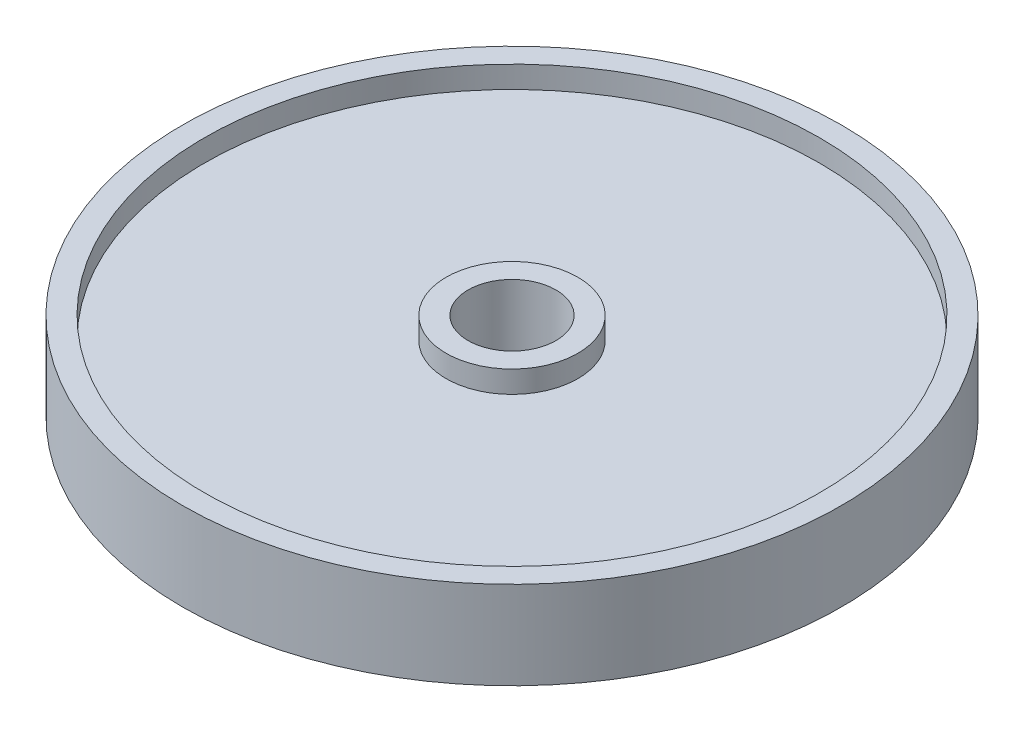
ISO-10303-21;
HEADER;
FILE_DESCRIPTION(('STEP AP214'),'2;1');
FILE_NAME('part.step','',(''),(''),'','','');
FILE_SCHEMA(('AUTOMOTIVE_DESIGN { 1 0 10303 214 1 1 1 1 }'));
ENDSEC;
DATA;
#1=APPLICATION_CONTEXT('core data for automotive mechanical design processes');
#2=APPLICATION_PROTOCOL_DEFINITION('international standard','automotive_design',2000,#1);
#3=PRODUCT_CONTEXT('',#1,'mechanical');
#4=PRODUCT('Part','Part','',(#3));
#5=PRODUCT_RELATED_PRODUCT_CATEGORY('part','',(#4));
#6=PRODUCT_DEFINITION_FORMATION('','',#4);
#7=PRODUCT_DEFINITION_CONTEXT('part definition',#1,'design');
#8=PRODUCT_DEFINITION('design','',#6,#7);
#9=PRODUCT_DEFINITION_SHAPE('','',#8);
#10=(LENGTH_UNIT() NAMED_UNIT(*) SI_UNIT(.MILLI.,.METRE.));
#11=(NAMED_UNIT(*) PLANE_ANGLE_UNIT() SI_UNIT($,.RADIAN.));
#12=(NAMED_UNIT(*) SI_UNIT($,.STERADIAN.) SOLID_ANGLE_UNIT());
#13=UNCERTAINTY_MEASURE_WITH_UNIT(LENGTH_MEASURE(1.E-05),#10,'distance_accuracy_value','');
#14=(GEOMETRIC_REPRESENTATION_CONTEXT(3) GLOBAL_UNCERTAINTY_ASSIGNED_CONTEXT((#13)) GLOBAL_UNIT_ASSIGNED_CONTEXT((#10,
#11,#12)) REPRESENTATION_CONTEXT('',''));
#15=CARTESIAN_POINT('',(0.,0.,0.));
#16=DIRECTION('',(0.,0.,1.));
#17=DIRECTION('',(1.,0.,0.));
#18=AXIS2_PLACEMENT_3D('',#15,#16,#17);
#19=CARTESIAN_POINT('',(0.,-9.48222589616056,0.));
#20=DIRECTION('',(0.,-1.,0.));
#21=DIRECTION('',(0.,0.,-1.));
#22=AXIS2_PLACEMENT_3D('',#19,#20,#21);
#23=CYLINDRICAL_SURFACE('',#22,5.);
#24=CARTESIAN_POINT('',(0.,-5.,0.));
#25=DIRECTION('',(0.,-1.,0.));
#26=DIRECTION('',(0.,0.,-1.));
#27=AXIS2_PLACEMENT_3D('',#24,#25,#26);
#28=CIRCLE('',#27,5.);
#29=CARTESIAN_POINT('',(0.,-5.,-5.));
#30=VERTEX_POINT('',#29);
#31=EDGE_CURVE('E10',#30,#30,#28,.T.);
#32=ORIENTED_EDGE('',*,*,#31,.T.);
#33=EDGE_LOOP('',(#32));
#34=FACE_BOUND('',#33,.T.);
#35=CARTESIAN_POINT('',(0.,5.,0.));
#36=DIRECTION('',(0.,-1.,0.));
#37=DIRECTION('',(0.,0.,-1.));
#38=AXIS2_PLACEMENT_3D('',#35,#36,#37);
#39=CIRCLE('',#38,5.);
#40=CARTESIAN_POINT('',(0.,5.,-5.));
#41=VERTEX_POINT('',#40);
#42=EDGE_CURVE('E75',#41,#41,#39,.T.);
#43=ORIENTED_EDGE('',*,*,#42,.F.);
#44=EDGE_LOOP('',(#43));
#45=FACE_BOUND('',#44,.T.);
#46=ADVANCED_FACE('F35',(#34,#45),#23,.F.);
#47=CARTESIAN_POINT('',(5.,-5.,0.));
#48=DIRECTION('',(0.,-1.,0.));
#49=DIRECTION('',(0.,0.,-1.));
#50=AXIS2_PLACEMENT_3D('',#47,#48,#49);
#51=PLANE('',#50);
#52=CARTESIAN_POINT('',(0.,-5.,0.));
#53=DIRECTION('',(0.,-1.,0.));
#54=DIRECTION('',(0.,0.,-1.));
#55=AXIS2_PLACEMENT_3D('',#52,#53,#54);
#56=CIRCLE('',#55,7.5);
#57=CARTESIAN_POINT('',(0.,-5.,-7.5));
#58=VERTEX_POINT('',#57);
#59=EDGE_CURVE('E41',#58,#58,#56,.T.);
#60=ORIENTED_EDGE('',*,*,#59,.T.);
#61=EDGE_LOOP('',(#60));
#62=FACE_BOUND('',#61,.T.);
#63=ORIENTED_EDGE('',*,*,#31,.F.);
#64=EDGE_LOOP('',(#63));
#65=FACE_BOUND('',#64,.T.);
#66=ADVANCED_FACE('F83',(#62,#65),#51,.T.);
#67=CARTESIAN_POINT('',(0.,-9.48222589616056,0.));
#68=DIRECTION('',(0.,-1.,0.));
#69=DIRECTION('',(0.,0.,-1.));
#70=AXIS2_PLACEMENT_3D('',#67,#68,#69);
#71=CYLINDRICAL_SURFACE('',#70,7.5);
#72=CARTESIAN_POINT('',(0.,-2.5,0.));
#73=DIRECTION('',(0.,-1.,0.));
#74=DIRECTION('',(0.,0.,-1.));
#75=AXIS2_PLACEMENT_3D('',#72,#73,#74);
#76=CIRCLE('',#75,7.5);
#77=CARTESIAN_POINT('',(0.,-2.5,-7.5));
#78=VERTEX_POINT('',#77);
#79=EDGE_CURVE('E45',#78,#78,#76,.T.);
#80=ORIENTED_EDGE('',*,*,#79,.T.);
#81=EDGE_LOOP('',(#80));
#82=FACE_BOUND('',#81,.T.);
#83=ORIENTED_EDGE('',*,*,#59,.F.);
#84=EDGE_LOOP('',(#83));
#85=FACE_BOUND('',#84,.T.);
#86=ADVANCED_FACE('F87',(#82,#85),#71,.T.);
#87=CARTESIAN_POINT('',(7.5,-2.5,0.));
#88=DIRECTION('',(0.,-1.,0.));
#89=DIRECTION('',(0.,0.,-1.));
#90=AXIS2_PLACEMENT_3D('',#87,#88,#89);
#91=PLANE('',#90);
#92=CARTESIAN_POINT('',(0.,-2.5,0.));
#93=DIRECTION('',(0.,-1.,0.));
#94=DIRECTION('',(0.,0.,-1.));
#95=AXIS2_PLACEMENT_3D('',#92,#93,#94);
#96=CIRCLE('',#95,35.);
#97=CARTESIAN_POINT('',(0.,-2.5,-35.));
#98=VERTEX_POINT('',#97);
#99=EDGE_CURVE('E49',#98,#98,#96,.T.);
#100=ORIENTED_EDGE('',*,*,#99,.T.);
#101=EDGE_LOOP('',(#100));
#102=FACE_BOUND('',#101,.T.);
#103=ORIENTED_EDGE('',*,*,#79,.F.);
#104=EDGE_LOOP('',(#103));
#105=FACE_BOUND('',#104,.T.);
#106=ADVANCED_FACE('F91',(#102,#105),#91,.T.);
#107=CARTESIAN_POINT('',(0.,-9.48222589616056,0.));
#108=DIRECTION('',(0.,-1.,0.));
#109=DIRECTION('',(0.,0.,-1.));
#110=AXIS2_PLACEMENT_3D('',#107,#108,#109);
#111=CYLINDRICAL_SURFACE('',#110,35.);
#112=CARTESIAN_POINT('',(0.,-5.,0.));
#113=DIRECTION('',(0.,-1.,0.));
#114=DIRECTION('',(0.,0.,-1.));
#115=AXIS2_PLACEMENT_3D('',#112,#113,#114);
#116=CIRCLE('',#115,35.);
#117=CARTESIAN_POINT('',(0.,-5.,-35.));
#118=VERTEX_POINT('',#117);
#119=EDGE_CURVE('E54',#118,#118,#116,.T.);
#120=ORIENTED_EDGE('',*,*,#119,.T.);
#121=EDGE_LOOP('',(#120));
#122=FACE_BOUND('',#121,.T.);
#123=ORIENTED_EDGE('',*,*,#99,.F.);
#124=EDGE_LOOP('',(#123));
#125=FACE_BOUND('',#124,.T.);
#126=ADVANCED_FACE('F98',(#122,#125),#111,.F.);
#127=CARTESIAN_POINT('',(35.,-5.,0.));
#128=DIRECTION('',(0.,-1.,0.));
#129=DIRECTION('',(0.,0.,-1.));
#130=AXIS2_PLACEMENT_3D('',#127,#128,#129);
#131=PLANE('',#130);
#132=CARTESIAN_POINT('',(0.,-5.,0.));
#133=DIRECTION('',(0.,-1.,0.));
#134=DIRECTION('',(0.,0.,-1.));
#135=AXIS2_PLACEMENT_3D('',#132,#133,#134);
#136=CIRCLE('',#135,37.5);
#137=CARTESIAN_POINT('',(0.,-5.,-37.5));
#138=VERTEX_POINT('',#137);
#139=EDGE_CURVE('E57',#138,#138,#136,.T.);
#140=ORIENTED_EDGE('',*,*,#139,.T.);
#141=EDGE_LOOP('',(#140));
#142=FACE_BOUND('',#141,.T.);
#143=ORIENTED_EDGE('',*,*,#119,.F.);
#144=EDGE_LOOP('',(#143));
#145=FACE_BOUND('',#144,.T.);
#146=ADVANCED_FACE('F102',(#142,#145),#131,.T.);
#147=CARTESIAN_POINT('',(0.,-9.48222589616056,0.));
#148=DIRECTION('',(0.,-1.,0.));
#149=DIRECTION('',(0.,0.,-1.));
#150=AXIS2_PLACEMENT_3D('',#147,#148,#149);
#151=CYLINDRICAL_SURFACE('',#150,37.5);
#152=CARTESIAN_POINT('',(0.,5.,0.));
#153=DIRECTION('',(0.,-1.,0.));
#154=DIRECTION('',(0.,0.,-1.));
#155=AXIS2_PLACEMENT_3D('',#152,#153,#154);
#156=CIRCLE('',#155,37.5);
#157=CARTESIAN_POINT('',(0.,5.,-37.5));
#158=VERTEX_POINT('',#157);
#159=EDGE_CURVE('E60',#158,#158,#156,.T.);
#160=ORIENTED_EDGE('',*,*,#159,.T.);
#161=EDGE_LOOP('',(#160));
#162=FACE_BOUND('',#161,.T.);
#163=ORIENTED_EDGE('',*,*,#139,.F.);
#164=EDGE_LOOP('',(#163));
#165=FACE_BOUND('',#164,.T.);
#166=ADVANCED_FACE('F106',(#162,#165),#151,.T.);
#167=CARTESIAN_POINT('',(35.,5.,0.));
#168=DIRECTION('',(0.,1.,0.));
#169=DIRECTION('',(0.,0.,1.));
#170=AXIS2_PLACEMENT_3D('',#167,#168,#169);
#171=PLANE('',#170);
#172=CARTESIAN_POINT('',(0.,5.,0.));
#173=DIRECTION('',(0.,-1.,0.));
#174=DIRECTION('',(0.,0.,-1.));
#175=AXIS2_PLACEMENT_3D('',#172,#173,#174);
#176=CIRCLE('',#175,35.);
#177=CARTESIAN_POINT('',(0.,5.,-35.));
#178=VERTEX_POINT('',#177);
#179=EDGE_CURVE('E63',#178,#178,#176,.T.);
#180=ORIENTED_EDGE('',*,*,#179,.T.);
#181=EDGE_LOOP('',(#180));
#182=FACE_BOUND('',#181,.T.);
#183=ORIENTED_EDGE('',*,*,#159,.F.);
#184=EDGE_LOOP('',(#183));
#185=FACE_BOUND('',#184,.T.);
#186=ADVANCED_FACE('F110',(#182,#185),#171,.T.);
#187=CARTESIAN_POINT('',(0.,-9.48222589616056,0.));
#188=DIRECTION('',(0.,-1.,0.));
#189=DIRECTION('',(0.,0.,-1.));
#190=AXIS2_PLACEMENT_3D('',#187,#188,#189);
#191=CYLINDRICAL_SURFACE('',#190,35.);
#192=CARTESIAN_POINT('',(0.,2.5,0.));
#193=DIRECTION('',(0.,-1.,0.));
#194=DIRECTION('',(0.,0.,-1.));
#195=AXIS2_PLACEMENT_3D('',#192,#193,#194);
#196=CIRCLE('',#195,35.);
#197=CARTESIAN_POINT('',(0.,2.5,-35.));
#198=VERTEX_POINT('',#197);
#199=EDGE_CURVE('E66',#198,#198,#196,.T.);
#200=ORIENTED_EDGE('',*,*,#199,.T.);
#201=EDGE_LOOP('',(#200));
#202=FACE_BOUND('',#201,.T.);
#203=ORIENTED_EDGE('',*,*,#179,.F.);
#204=EDGE_LOOP('',(#203));
#205=FACE_BOUND('',#204,.T.);
#206=ADVANCED_FACE('F114',(#202,#205),#191,.F.);
#207=CARTESIAN_POINT('',(7.5,2.5,0.));
#208=DIRECTION('',(0.,1.,0.));
#209=DIRECTION('',(0.,0.,1.));
#210=AXIS2_PLACEMENT_3D('',#207,#208,#209);
#211=PLANE('',#210);
#212=CARTESIAN_POINT('',(0.,2.5,0.));
#213=DIRECTION('',(0.,-1.,0.));
#214=DIRECTION('',(0.,0.,-1.));
#215=AXIS2_PLACEMENT_3D('',#212,#213,#214);
#216=CIRCLE('',#215,7.5);
#217=CARTESIAN_POINT('',(0.,2.5,-7.5));
#218=VERTEX_POINT('',#217);
#219=EDGE_CURVE('E69',#218,#218,#216,.T.);
#220=ORIENTED_EDGE('',*,*,#219,.T.);
#221=EDGE_LOOP('',(#220));
#222=FACE_BOUND('',#221,.T.);
#223=ORIENTED_EDGE('',*,*,#199,.F.);
#224=EDGE_LOOP('',(#223));
#225=FACE_BOUND('',#224,.T.);
#226=ADVANCED_FACE('F118',(#222,#225),#211,.T.);
#227=CARTESIAN_POINT('',(0.,-9.48222589616056,0.));
#228=DIRECTION('',(0.,-1.,0.));
#229=DIRECTION('',(0.,0.,-1.));
#230=AXIS2_PLACEMENT_3D('',#227,#228,#229);
#231=CYLINDRICAL_SURFACE('',#230,7.5);
#232=CARTESIAN_POINT('',(0.,5.,0.));
#233=DIRECTION('',(0.,-1.,0.));
#234=DIRECTION('',(0.,0.,-1.));
#235=AXIS2_PLACEMENT_3D('',#232,#233,#234);
#236=CIRCLE('',#235,7.5);
#237=CARTESIAN_POINT('',(0.,5.,-7.5));
#238=VERTEX_POINT('',#237);
#239=EDGE_CURVE('E72',#238,#238,#236,.T.);
#240=ORIENTED_EDGE('',*,*,#239,.T.);
#241=EDGE_LOOP('',(#240));
#242=FACE_BOUND('',#241,.T.);
#243=ORIENTED_EDGE('',*,*,#219,.F.);
#244=EDGE_LOOP('',(#243));
#245=FACE_BOUND('',#244,.T.);
#246=ADVANCED_FACE('F122',(#242,#245),#231,.T.);
#247=CARTESIAN_POINT('',(5.,5.,0.));
#248=DIRECTION('',(0.,1.,0.));
#249=DIRECTION('',(0.,0.,1.));
#250=AXIS2_PLACEMENT_3D('',#247,#248,#249);
#251=PLANE('',#250);
#252=ORIENTED_EDGE('',*,*,#42,.T.);
#253=EDGE_LOOP('',(#252));
#254=FACE_BOUND('',#253,.T.);
#255=ORIENTED_EDGE('',*,*,#239,.F.);
#256=EDGE_LOOP('',(#255));
#257=FACE_BOUND('',#256,.T.);
#258=ADVANCED_FACE('F79',(#254,#257),#251,.T.);
#259=CLOSED_SHELL('',(#46,#66,#86,#106,#126,#146,#166,#186,#206,#226,#246,#258));
#260=MANIFOLD_SOLID_BREP('B2',#259);
#261=ADVANCED_BREP_SHAPE_REPRESENTATION('',(#18,#260),#14);
#262=SHAPE_DEFINITION_REPRESENTATION(#9,#261);
ENDSEC;
END-ISO-10303-21;
